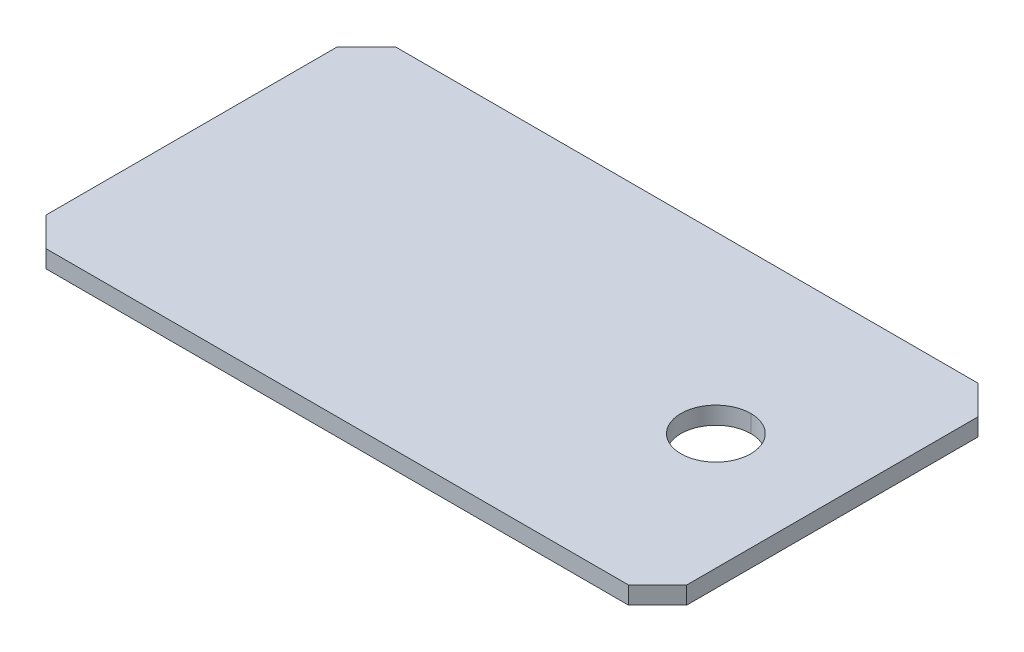
ISO-10303-21;
HEADER;
FILE_DESCRIPTION(('STEP AP214'),'2;1');
FILE_NAME('part.step','',(''),(''),'','','');
FILE_SCHEMA(('AUTOMOTIVE_DESIGN { 1 0 10303 214 1 1 1 1 }'));
ENDSEC;
DATA;
#1=APPLICATION_CONTEXT('core data for automotive mechanical design processes');
#2=APPLICATION_PROTOCOL_DEFINITION('international standard','automotive_design',2000,#1);
#3=PRODUCT_CONTEXT('',#1,'mechanical');
#4=PRODUCT('Part','Part','',(#3));
#5=PRODUCT_RELATED_PRODUCT_CATEGORY('part','',(#4));
#6=PRODUCT_DEFINITION_FORMATION('','',#4);
#7=PRODUCT_DEFINITION_CONTEXT('part definition',#1,'design');
#8=PRODUCT_DEFINITION('design','',#6,#7);
#9=PRODUCT_DEFINITION_SHAPE('','',#8);
#10=(LENGTH_UNIT() NAMED_UNIT(*) SI_UNIT(.MILLI.,.METRE.));
#11=(NAMED_UNIT(*) PLANE_ANGLE_UNIT() SI_UNIT($,.RADIAN.));
#12=(NAMED_UNIT(*) SI_UNIT($,.STERADIAN.) SOLID_ANGLE_UNIT());
#13=UNCERTAINTY_MEASURE_WITH_UNIT(LENGTH_MEASURE(1.E-05),#10,'distance_accuracy_value','');
#14=(GEOMETRIC_REPRESENTATION_CONTEXT(3) GLOBAL_UNCERTAINTY_ASSIGNED_CONTEXT((#13)) GLOBAL_UNIT_ASSIGNED_CONTEXT((#10,
#11,#12)) REPRESENTATION_CONTEXT('',''));
#15=CARTESIAN_POINT('',(0.,0.,0.));
#16=DIRECTION('',(0.,0.,1.));
#17=DIRECTION('',(1.,0.,0.));
#18=AXIS2_PLACEMENT_3D('',#15,#16,#17);
#19=CARTESIAN_POINT('',(40.,0.,0.));
#20=DIRECTION('',(0.,1.,0.));
#21=DIRECTION('',(0.,0.,1.));
#22=AXIS2_PLACEMENT_3D('',#19,#20,#21);
#23=CYLINDRICAL_SURFACE('',#22,6.);
#24=DIRECTION('',(0.,1.,0.));
#25=VECTOR('',#24,1.);
#26=CARTESIAN_POINT('',(40.,0.,-6.));
#27=LINE('',#26,#25);
#28=CARTESIAN_POINT('',(40.,0.,-6.));
#29=VERTEX_POINT('',#28);
#30=CARTESIAN_POINT('',(40.,3.,-6.));
#31=VERTEX_POINT('',#30);
#32=EDGE_CURVE('E134',#29,#31,#27,.T.);
#33=ORIENTED_EDGE('',*,*,#32,.F.);
#34=CARTESIAN_POINT('',(40.,0.,0.));
#35=DIRECTION('',(0.,1.,0.));
#36=DIRECTION('',(0.,0.,1.));
#37=AXIS2_PLACEMENT_3D('',#34,#35,#36);
#38=CIRCLE('',#37,6.);
#39=CARTESIAN_POINT('',(40.,0.,6.));
#40=VERTEX_POINT('',#39);
#41=EDGE_CURVE('E12',#40,#29,#38,.T.);
#42=ORIENTED_EDGE('',*,*,#41,.F.);
#43=DIRECTION('',(0.,1.,0.));
#44=VECTOR('',#43,1.);
#45=CARTESIAN_POINT('',(40.,0.,6.));
#46=LINE('',#45,#44);
#47=CARTESIAN_POINT('',(40.,3.,6.));
#48=VERTEX_POINT('',#47);
#49=EDGE_CURVE('E145',#40,#48,#46,.T.);
#50=ORIENTED_EDGE('',*,*,#49,.T.);
#51=CARTESIAN_POINT('',(40.,3.,0.));
#52=DIRECTION('',(0.,1.,0.));
#53=DIRECTION('',(0.,0.,1.));
#54=AXIS2_PLACEMENT_3D('',#51,#52,#53);
#55=CIRCLE('',#54,6.);
#56=EDGE_CURVE('E137',#48,#31,#55,.T.);
#57=ORIENTED_EDGE('',*,*,#56,.T.);
#58=EDGE_LOOP('',(#33,#42,#50,#57));
#59=FACE_BOUND('',#58,.T.);
#60=ADVANCED_FACE('F20',(#59),#23,.F.);
#61=CARTESIAN_POINT('',(60.,3.,25.));
#62=DIRECTION('',(0.707106781186546,0.,0.70710678118655));
#63=DIRECTION('',(0.,-1.,0.));
#64=AXIS2_PLACEMENT_3D('',#61,#62,#63);
#65=PLANE('',#64);
#66=DIRECTION('',(0.70710678118655,0.,-0.707106781186546));
#67=VECTOR('',#66,1.);
#68=CARTESIAN_POINT('',(42.5,3.,42.5));
#69=LINE('',#68,#67);
#70=CARTESIAN_POINT('',(55.,3.,30.));
#71=VERTEX_POINT('',#70);
#72=CARTESIAN_POINT('',(60.,3.,25.));
#73=VERTEX_POINT('',#72);
#74=EDGE_CURVE('E221',#71,#73,#69,.T.);
#75=ORIENTED_EDGE('',*,*,#74,.F.);
#76=DIRECTION('',(0.,1.,0.));
#77=VECTOR('',#76,1.);
#78=CARTESIAN_POINT('',(55.,3.,30.));
#79=LINE('',#78,#77);
#80=CARTESIAN_POINT('',(55.,0.,30.));
#81=VERTEX_POINT('',#80);
#82=EDGE_CURVE('E194',#81,#71,#79,.T.);
#83=ORIENTED_EDGE('',*,*,#82,.F.);
#84=DIRECTION('',(-0.70710678118655,0.,0.707106781186546));
#85=VECTOR('',#84,1.);
#86=CARTESIAN_POINT('',(60.,0.,25.));
#87=LINE('',#86,#85);
#88=CARTESIAN_POINT('',(60.,0.,25.));
#89=VERTEX_POINT('',#88);
#90=EDGE_CURVE('E236',#89,#81,#87,.T.);
#91=ORIENTED_EDGE('',*,*,#90,.F.);
#92=DIRECTION('',(0.,-1.,0.));
#93=VECTOR('',#92,1.);
#94=CARTESIAN_POINT('',(60.,0.,25.));
#95=LINE('',#94,#93);
#96=EDGE_CURVE('E166',#73,#89,#95,.T.);
#97=ORIENTED_EDGE('',*,*,#96,.F.);
#98=EDGE_LOOP('',(#75,#83,#91,#97));
#99=FACE_BOUND('',#98,.T.);
#100=ADVANCED_FACE('F22',(#99),#65,.T.);
#101=CARTESIAN_POINT('',(55.,3.,-30.));
#102=DIRECTION('',(-0.707106781186548,0.,0.707106781186548));
#103=DIRECTION('',(0.,1.,0.));
#104=AXIS2_PLACEMENT_3D('',#101,#102,#103);
#105=PLANE('',#104);
#106=DIRECTION('',(-0.707106781186548,0.,-0.707106781186548));
#107=VECTOR('',#106,1.);
#108=CARTESIAN_POINT('',(42.5,3.,-42.5));
#109=LINE('',#108,#107);
#110=CARTESIAN_POINT('',(60.,3.,-25.));
#111=VERTEX_POINT('',#110);
#112=CARTESIAN_POINT('',(55.,3.,-30.));
#113=VERTEX_POINT('',#112);
#114=EDGE_CURVE('E45',#111,#113,#109,.T.);
#115=ORIENTED_EDGE('',*,*,#114,.F.);
#116=DIRECTION('',(0.,1.,0.));
#117=VECTOR('',#116,1.);
#118=CARTESIAN_POINT('',(60.,3.,-25.));
#119=LINE('',#118,#117);
#120=CARTESIAN_POINT('',(60.,0.,-25.));
#121=VERTEX_POINT('',#120);
#122=EDGE_CURVE('E147',#121,#111,#119,.T.);
#123=ORIENTED_EDGE('',*,*,#122,.F.);
#124=DIRECTION('',(0.707106781186548,0.,0.707106781186548));
#125=VECTOR('',#124,1.);
#126=CARTESIAN_POINT('',(55.,0.,-30.));
#127=LINE('',#126,#125);
#128=CARTESIAN_POINT('',(55.,0.,-30.));
#129=VERTEX_POINT('',#128);
#130=EDGE_CURVE('E232',#129,#121,#127,.T.);
#131=ORIENTED_EDGE('',*,*,#130,.F.);
#132=DIRECTION('',(0.,-1.,0.));
#133=VECTOR('',#132,1.);
#134=CARTESIAN_POINT('',(55.,3.,-30.));
#135=LINE('',#134,#133);
#136=EDGE_CURVE('E214',#113,#129,#135,.T.);
#137=ORIENTED_EDGE('',*,*,#136,.F.);
#138=EDGE_LOOP('',(#115,#123,#131,#137));
#139=FACE_BOUND('',#138,.T.);
#140=ADVANCED_FACE('F260',(#139),#105,.F.);
#141=CARTESIAN_POINT('',(-45.,3.,30.));
#142=DIRECTION('',(0.707106781186548,0.,-0.707106781186548));
#143=DIRECTION('',(0.,-1.,0.));
#144=AXIS2_PLACEMENT_3D('',#141,#142,#143);
#145=PLANE('',#144);
#146=DIRECTION('',(0.707106781186548,0.,0.707106781186548));
#147=VECTOR('',#146,1.);
#148=CARTESIAN_POINT('',(-37.5,3.,37.5));
#149=LINE('',#148,#147);
#150=CARTESIAN_POINT('',(-50.,3.,25.));
#151=VERTEX_POINT('',#150);
#152=CARTESIAN_POINT('',(-45.,3.,30.));
#153=VERTEX_POINT('',#152);
#154=EDGE_CURVE('E222',#151,#153,#149,.T.);
#155=ORIENTED_EDGE('',*,*,#154,.F.);
#156=DIRECTION('',(0.,1.,0.));
#157=VECTOR('',#156,1.);
#158=CARTESIAN_POINT('',(-50.,3.,25.));
#159=LINE('',#158,#157);
#160=CARTESIAN_POINT('',(-50.,0.,25.));
#161=VERTEX_POINT('',#160);
#162=EDGE_CURVE('E177',#161,#151,#159,.T.);
#163=ORIENTED_EDGE('',*,*,#162,.F.);
#164=DIRECTION('',(-0.707106781186548,0.,-0.707106781186548));
#165=VECTOR('',#164,1.);
#166=CARTESIAN_POINT('',(-45.,0.,30.));
#167=LINE('',#166,#165);
#168=CARTESIAN_POINT('',(-45.,0.,30.));
#169=VERTEX_POINT('',#168);
#170=EDGE_CURVE('E26',#169,#161,#167,.T.);
#171=ORIENTED_EDGE('',*,*,#170,.F.);
#172=DIRECTION('',(0.,-1.,0.));
#173=VECTOR('',#172,1.);
#174=CARTESIAN_POINT('',(-45.,3.,30.));
#175=LINE('',#174,#173);
#176=EDGE_CURVE('E178',#153,#169,#175,.T.);
#177=ORIENTED_EDGE('',*,*,#176,.F.);
#178=EDGE_LOOP('',(#155,#163,#171,#177));
#179=FACE_BOUND('',#178,.T.);
#180=ADVANCED_FACE('F250',(#179),#145,.F.);
#181=CARTESIAN_POINT('',(-50.,3.,-25.));
#182=DIRECTION('',(-0.707106781186547,0.,-0.707106781186549));
#183=DIRECTION('',(-0.707106781186549,0.,0.707106781186547));
#184=AXIS2_PLACEMENT_3D('',#181,#182,#183);
#185=PLANE('',#184);
#186=DIRECTION('',(-0.707106781186549,0.,0.707106781186547));
#187=VECTOR('',#186,1.);
#188=CARTESIAN_POINT('',(-37.5,3.,-37.5));
#189=LINE('',#188,#187);
#190=CARTESIAN_POINT('',(-45.,3.,-30.));
#191=VERTEX_POINT('',#190);
#192=CARTESIAN_POINT('',(-50.,3.,-25.));
#193=VERTEX_POINT('',#192);
#194=EDGE_CURVE('E52',#191,#193,#189,.T.);
#195=ORIENTED_EDGE('',*,*,#194,.F.);
#196=DIRECTION('',(0.,1.,0.));
#197=VECTOR('',#196,1.);
#198=CARTESIAN_POINT('',(-45.,3.,-30.));
#199=LINE('',#198,#197);
#200=CARTESIAN_POINT('',(-45.,0.,-30.));
#201=VERTEX_POINT('',#200);
#202=EDGE_CURVE('E210',#201,#191,#199,.T.);
#203=ORIENTED_EDGE('',*,*,#202,.F.);
#204=DIRECTION('',(0.707106781186549,0.,-0.707106781186547));
#205=VECTOR('',#204,1.);
#206=CARTESIAN_POINT('',(-50.,0.,-25.));
#207=LINE('',#206,#205);
#208=CARTESIAN_POINT('',(-50.,0.,-25.));
#209=VERTEX_POINT('',#208);
#210=EDGE_CURVE('E231',#209,#201,#207,.T.);
#211=ORIENTED_EDGE('',*,*,#210,.F.);
#212=DIRECTION('',(0.,-1.,0.));
#213=VECTOR('',#212,1.);
#214=CARTESIAN_POINT('',(-50.,0.,-25.));
#215=LINE('',#214,#213);
#216=EDGE_CURVE('E164',#193,#209,#215,.T.);
#217=ORIENTED_EDGE('',*,*,#216,.F.);
#218=EDGE_LOOP('',(#195,#203,#211,#217));
#219=FACE_BOUND('',#218,.T.);
#220=ADVANCED_FACE('F253',(#219),#185,.T.);
#221=CARTESIAN_POINT('',(0.,0.,0.));
#222=DIRECTION('',(0.,1.,0.));
#223=DIRECTION('',(1.,0.,0.));
#224=AXIS2_PLACEMENT_3D('',#221,#222,#223);
#225=PLANE('',#224);
#226=ORIENTED_EDGE('',*,*,#41,.T.);
#227=CARTESIAN_POINT('',(40.,0.,0.));
#228=DIRECTION('',(0.,1.,0.));
#229=DIRECTION('',(0.,0.,1.));
#230=AXIS2_PLACEMENT_3D('',#227,#228,#229);
#231=CIRCLE('',#230,6.);
#232=EDGE_CURVE('E129',#29,#40,#231,.T.);
#233=ORIENTED_EDGE('',*,*,#232,.T.);
#234=EDGE_LOOP('',(#226,#233));
#235=FACE_BOUND('',#234,.T.);
#236=DIRECTION('',(0.,0.,1.));
#237=VECTOR('',#236,1.);
#238=CARTESIAN_POINT('',(-50.,0.,-30.));
#239=LINE('',#238,#237);
#240=EDGE_CURVE('E174',#209,#161,#239,.T.);
#241=ORIENTED_EDGE('',*,*,#240,.F.);
#242=ORIENTED_EDGE('',*,*,#210,.T.);
#243=DIRECTION('',(1.,0.,0.));
#244=VECTOR('',#243,1.);
#245=CARTESIAN_POINT('',(-50.,0.,-30.));
#246=LINE('',#245,#244);
#247=EDGE_CURVE('E201',#201,#129,#246,.T.);
#248=ORIENTED_EDGE('',*,*,#247,.T.);
#249=ORIENTED_EDGE('',*,*,#130,.T.);
#250=DIRECTION('',(0.,0.,1.));
#251=VECTOR('',#250,1.);
#252=CARTESIAN_POINT('',(60.,0.,-30.));
#253=LINE('',#252,#251);
#254=EDGE_CURVE('E154',#121,#89,#253,.T.);
#255=ORIENTED_EDGE('',*,*,#254,.T.);
#256=ORIENTED_EDGE('',*,*,#90,.T.);
#257=DIRECTION('',(1.,0.,0.));
#258=VECTOR('',#257,1.);
#259=CARTESIAN_POINT('',(-50.,0.,30.));
#260=LINE('',#259,#258);
#261=EDGE_CURVE('E188',#169,#81,#260,.T.);
#262=ORIENTED_EDGE('',*,*,#261,.F.);
#263=ORIENTED_EDGE('',*,*,#170,.T.);
#264=EDGE_LOOP('',(#241,#242,#248,#249,#255,#256,#262,#263));
#265=FACE_BOUND('',#264,.T.);
#266=ADVANCED_FACE('F126',(#235,#265),#225,.F.);
#267=CARTESIAN_POINT('',(0.,3.,0.));
#268=DIRECTION('',(0.,1.,0.));
#269=DIRECTION('',(1.,0.,0.));
#270=AXIS2_PLACEMENT_3D('',#267,#268,#269);
#271=PLANE('',#270);
#272=ORIENTED_EDGE('',*,*,#56,.F.);
#273=CARTESIAN_POINT('',(40.,3.,0.));
#274=DIRECTION('',(0.,1.,0.));
#275=DIRECTION('',(0.,0.,1.));
#276=AXIS2_PLACEMENT_3D('',#273,#274,#275);
#277=CIRCLE('',#276,6.);
#278=EDGE_CURVE('E143',#31,#48,#277,.T.);
#279=ORIENTED_EDGE('',*,*,#278,.F.);
#280=EDGE_LOOP('',(#272,#279));
#281=FACE_BOUND('',#280,.T.);
#282=DIRECTION('',(1.,0.,0.));
#283=VECTOR('',#282,1.);
#284=CARTESIAN_POINT('',(-50.,3.,-30.));
#285=LINE('',#284,#283);
#286=EDGE_CURVE('E211',#191,#113,#285,.T.);
#287=ORIENTED_EDGE('',*,*,#286,.F.);
#288=ORIENTED_EDGE('',*,*,#194,.T.);
#289=DIRECTION('',(0.,0.,1.));
#290=VECTOR('',#289,1.);
#291=CARTESIAN_POINT('',(-50.,3.,-30.));
#292=LINE('',#291,#290);
#293=EDGE_CURVE('E159',#193,#151,#292,.T.);
#294=ORIENTED_EDGE('',*,*,#293,.T.);
#295=ORIENTED_EDGE('',*,*,#154,.T.);
#296=DIRECTION('',(1.,0.,0.));
#297=VECTOR('',#296,1.);
#298=CARTESIAN_POINT('',(-50.,3.,30.));
#299=LINE('',#298,#297);
#300=EDGE_CURVE('E173',#153,#71,#299,.T.);
#301=ORIENTED_EDGE('',*,*,#300,.T.);
#302=ORIENTED_EDGE('',*,*,#74,.T.);
#303=DIRECTION('',(0.,0.,1.));
#304=VECTOR('',#303,1.);
#305=CARTESIAN_POINT('',(60.,3.,-30.));
#306=LINE('',#305,#304);
#307=EDGE_CURVE('E152',#111,#73,#306,.T.);
#308=ORIENTED_EDGE('',*,*,#307,.F.);
#309=ORIENTED_EDGE('',*,*,#114,.T.);
#310=EDGE_LOOP('',(#287,#288,#294,#295,#301,#302,#308,#309));
#311=FACE_BOUND('',#310,.T.);
#312=ADVANCED_FACE('F270',(#281,#311),#271,.T.);
#313=CARTESIAN_POINT('',(-50.,3.,-30.));
#314=DIRECTION('',(0.,0.,-1.));
#315=DIRECTION('',(0.,-1.,0.));
#316=AXIS2_PLACEMENT_3D('',#313,#314,#315);
#317=PLANE('',#316);
#318=ORIENTED_EDGE('',*,*,#247,.F.);
#319=ORIENTED_EDGE('',*,*,#202,.T.);
#320=ORIENTED_EDGE('',*,*,#286,.T.);
#321=ORIENTED_EDGE('',*,*,#136,.T.);
#322=EDGE_LOOP('',(#318,#319,#320,#321));
#323=FACE_BOUND('',#322,.T.);
#324=ADVANCED_FACE('F254',(#323),#317,.T.);
#325=CARTESIAN_POINT('',(60.,3.,-30.));
#326=DIRECTION('',(1.,0.,0.));
#327=DIRECTION('',(0.,0.,-1.));
#328=AXIS2_PLACEMENT_3D('',#325,#326,#327);
#329=PLANE('',#328);
#330=ORIENTED_EDGE('',*,*,#254,.F.);
#331=ORIENTED_EDGE('',*,*,#122,.T.);
#332=ORIENTED_EDGE('',*,*,#307,.T.);
#333=ORIENTED_EDGE('',*,*,#96,.T.);
#334=EDGE_LOOP('',(#330,#331,#332,#333));
#335=FACE_BOUND('',#334,.T.);
#336=ADVANCED_FACE('F257',(#335),#329,.T.);
#337=CARTESIAN_POINT('',(-50.,3.,30.));
#338=DIRECTION('',(0.,0.,-1.));
#339=DIRECTION('',(0.,-1.,0.));
#340=AXIS2_PLACEMENT_3D('',#337,#338,#339);
#341=PLANE('',#340);
#342=ORIENTED_EDGE('',*,*,#300,.F.);
#343=ORIENTED_EDGE('',*,*,#176,.T.);
#344=ORIENTED_EDGE('',*,*,#261,.T.);
#345=ORIENTED_EDGE('',*,*,#82,.T.);
#346=EDGE_LOOP('',(#342,#343,#344,#345));
#347=FACE_BOUND('',#346,.T.);
#348=ADVANCED_FACE('F266',(#347),#341,.F.);
#349=CARTESIAN_POINT('',(-50.,3.,-30.));
#350=DIRECTION('',(1.,0.,0.));
#351=DIRECTION('',(0.,0.,-1.));
#352=AXIS2_PLACEMENT_3D('',#349,#350,#351);
#353=PLANE('',#352);
#354=ORIENTED_EDGE('',*,*,#293,.F.);
#355=ORIENTED_EDGE('',*,*,#216,.T.);
#356=ORIENTED_EDGE('',*,*,#240,.T.);
#357=ORIENTED_EDGE('',*,*,#162,.T.);
#358=EDGE_LOOP('',(#354,#355,#356,#357));
#359=FACE_BOUND('',#358,.T.);
#360=ADVANCED_FACE('F248',(#359),#353,.F.);
#361=CARTESIAN_POINT('',(40.,0.,0.));
#362=DIRECTION('',(0.,1.,0.));
#363=DIRECTION('',(0.,0.,1.));
#364=AXIS2_PLACEMENT_3D('',#361,#362,#363);
#365=CYLINDRICAL_SURFACE('',#364,6.);
#366=ORIENTED_EDGE('',*,*,#232,.F.);
#367=ORIENTED_EDGE('',*,*,#32,.T.);
#368=ORIENTED_EDGE('',*,*,#278,.T.);
#369=ORIENTED_EDGE('',*,*,#49,.F.);
#370=EDGE_LOOP('',(#366,#367,#368,#369));
#371=FACE_BOUND('',#370,.T.);
#372=ADVANCED_FACE('F141',(#371),#365,.F.);
#373=CLOSED_SHELL('',(#60,#100,#140,#180,#220,#266,#312,#324,#336,#348,#360,#372));
#374=MANIFOLD_SOLID_BREP('B1',#373);
#375=ADVANCED_BREP_SHAPE_REPRESENTATION('',(#18,#374),#14);
#376=SHAPE_DEFINITION_REPRESENTATION(#9,#375);
ENDSEC;
END-ISO-10303-21;
